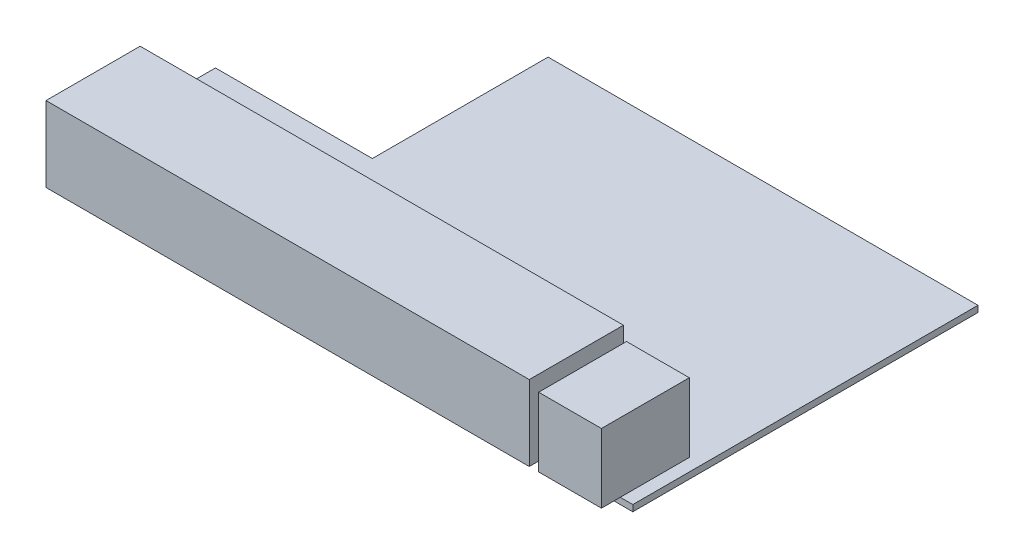
ISO-10303-21;
HEADER;
FILE_DESCRIPTION(('STEP AP214'),'2;1');
FILE_NAME('part.step','',(''),(''),'','','');
FILE_SCHEMA(('AUTOMOTIVE_DESIGN { 1 0 10303 214 1 1 1 1 }'));
ENDSEC;
DATA;
#1=APPLICATION_CONTEXT('core data for automotive mechanical design processes');
#2=APPLICATION_PROTOCOL_DEFINITION('international standard','automotive_design',2000,#1);
#3=PRODUCT_CONTEXT('',#1,'mechanical');
#4=PRODUCT('Part','Part','',(#3));
#5=PRODUCT_RELATED_PRODUCT_CATEGORY('part','',(#4));
#6=PRODUCT_DEFINITION_FORMATION('','',#4);
#7=PRODUCT_DEFINITION_CONTEXT('part definition',#1,'design');
#8=PRODUCT_DEFINITION('design','',#6,#7);
#9=PRODUCT_DEFINITION_SHAPE('','',#8);
#10=(LENGTH_UNIT() NAMED_UNIT(*) SI_UNIT(.MILLI.,.METRE.));
#11=(NAMED_UNIT(*) PLANE_ANGLE_UNIT() SI_UNIT($,.RADIAN.));
#12=(NAMED_UNIT(*) SI_UNIT($,.STERADIAN.) SOLID_ANGLE_UNIT());
#13=UNCERTAINTY_MEASURE_WITH_UNIT(LENGTH_MEASURE(1.E-05),#10,'distance_accuracy_value','');
#14=(GEOMETRIC_REPRESENTATION_CONTEXT(3) GLOBAL_UNCERTAINTY_ASSIGNED_CONTEXT((#13)) GLOBAL_UNIT_ASSIGNED_CONTEXT((#10,
#11,#12)) REPRESENTATION_CONTEXT('',''));
#15=CARTESIAN_POINT('',(0.,0.,0.));
#16=DIRECTION('',(0.,0.,1.));
#17=DIRECTION('',(1.,0.,0.));
#18=AXIS2_PLACEMENT_3D('',#15,#16,#17);
#19=CARTESIAN_POINT('',(0.,1.,0.));
#20=DIRECTION('',(0.,-1.,0.));
#21=DIRECTION('',(0.,0.,-1.));
#22=AXIS2_PLACEMENT_3D('',#19,#20,#21);
#23=PLANE('',#22);
#24=DIRECTION('',(0.,0.,1.));
#25=VECTOR('',#24,1.);
#26=CARTESIAN_POINT('',(34.5329737002502,1.,16.6276625292646));
#27=LINE('',#26,#25);
#28=CARTESIAN_POINT('',(34.5329737002502,1.,16.6276625292646));
#29=VERTEX_POINT('',#28);
#30=CARTESIAN_POINT('',(34.5329737002502,1.,27.6276625292646));
#31=VERTEX_POINT('',#30);
#32=EDGE_CURVE('E64',#29,#31,#27,.T.);
#33=ORIENTED_EDGE('',*,*,#32,.F.);
#34=DIRECTION('',(-1.,0.,0.));
#35=VECTOR('',#34,1.);
#36=CARTESIAN_POINT('',(34.5329737002502,1.,16.6276625292646));
#37=LINE('',#36,#35);
#38=CARTESIAN_POINT('',(44.5329737002502,1.,16.6276625292646));
#39=VERTEX_POINT('',#38);
#40=EDGE_CURVE('E68',#39,#29,#37,.T.);
#41=ORIENTED_EDGE('',*,*,#40,.F.);
#42=DIRECTION('',(0.,0.,-1.));
#43=VECTOR('',#42,1.);
#44=CARTESIAN_POINT('',(44.5329737002502,1.,16.6276625292646));
#45=LINE('',#44,#43);
#46=CARTESIAN_POINT('',(44.5329737002502,1.,27.6276625292646));
#47=VERTEX_POINT('',#46);
#48=EDGE_CURVE('E497',#47,#39,#45,.T.);
#49=ORIENTED_EDGE('',*,*,#48,.F.);
#50=DIRECTION('',(1.,0.,0.));
#51=VECTOR('',#50,1.);
#52=CARTESIAN_POINT('',(-46.9670262997498,1.,27.6276625292646));
#53=LINE('',#52,#51);
#54=CARTESIAN_POINT('',(46.5329737002502,1.,27.6276625292646));
#55=VERTEX_POINT('',#54);
#56=EDGE_CURVE('E253',#47,#55,#53,.T.);
#57=ORIENTED_EDGE('',*,*,#56,.T.);
#58=DIRECTION('',(0.,0.,1.));
#59=VECTOR('',#58,1.);
#60=CARTESIAN_POINT('',(46.5329737002502,1.,-27.3723374707354));
#61=LINE('',#60,#59);
#62=CARTESIAN_POINT('',(46.5329737002502,1.,-27.3723374707354));
#63=VERTEX_POINT('',#62);
#64=EDGE_CURVE('E249',#63,#55,#61,.T.);
#65=ORIENTED_EDGE('',*,*,#64,.F.);
#66=DIRECTION('',(1.,0.,0.));
#67=VECTOR('',#66,1.);
#68=CARTESIAN_POINT('',(-21.9670262997498,1.,-27.3723374707354));
#69=LINE('',#68,#67);
#70=CARTESIAN_POINT('',(-21.9670262997498,1.,-27.3723374707354));
#71=VERTEX_POINT('',#70);
#72=EDGE_CURVE('E244',#71,#63,#69,.T.);
#73=ORIENTED_EDGE('',*,*,#72,.F.);
#74=DIRECTION('',(0.,0.,-1.));
#75=VECTOR('',#74,1.);
#76=CARTESIAN_POINT('',(-21.9670262997498,1.,0.627662529264608));
#77=LINE('',#76,#75);
#78=CARTESIAN_POINT('',(-21.9670262997498,1.,0.627662529264608));
#79=VERTEX_POINT('',#78);
#80=EDGE_CURVE('E240',#79,#71,#77,.T.);
#81=ORIENTED_EDGE('',*,*,#80,.F.);
#82=DIRECTION('',(1.,0.,0.));
#83=VECTOR('',#82,1.);
#84=CARTESIAN_POINT('',(-46.9670262997498,1.,0.627662529264608));
#85=LINE('',#84,#83);
#86=CARTESIAN_POINT('',(-46.9670262997498,1.,0.627662529264608));
#87=VERTEX_POINT('',#86);
#88=EDGE_CURVE('E262',#87,#79,#85,.T.);
#89=ORIENTED_EDGE('',*,*,#88,.F.);
#90=DIRECTION('',(0.,0.,1.));
#91=VECTOR('',#90,1.);
#92=CARTESIAN_POINT('',(-46.9670262997498,1.,0.627662529264608));
#93=LINE('',#92,#91);
#94=CARTESIAN_POINT('',(-46.9670262997498,1.,27.6276625292646));
#95=VERTEX_POINT('',#94);
#96=EDGE_CURVE('E258',#87,#95,#93,.T.);
#97=ORIENTED_EDGE('',*,*,#96,.T.);
#98=CARTESIAN_POINT('',(-43.9670262997498,1.,27.6276625292646));
#99=VERTEX_POINT('',#98);
#100=EDGE_CURVE('E254',#95,#99,#53,.T.);
#101=ORIENTED_EDGE('',*,*,#100,.T.);
#102=DIRECTION('',(0.,0.,1.));
#103=VECTOR('',#102,1.);
#104=CARTESIAN_POINT('',(-43.9670262997498,1.,15.6276625292646));
#105=LINE('',#104,#103);
#106=CARTESIAN_POINT('',(-43.9670262997498,1.,15.6276625292646));
#107=VERTEX_POINT('',#106);
#108=EDGE_CURVE('E193',#107,#99,#105,.T.);
#109=ORIENTED_EDGE('',*,*,#108,.F.);
#110=DIRECTION('',(-1.,0.,0.));
#111=VECTOR('',#110,1.);
#112=CARTESIAN_POINT('',(-43.9670262997498,1.,15.6276625292646));
#113=LINE('',#112,#111);
#114=CARTESIAN_POINT('',(33.0329737002502,1.,15.6276625292646));
#115=VERTEX_POINT('',#114);
#116=EDGE_CURVE('E204',#115,#107,#113,.T.);
#117=ORIENTED_EDGE('',*,*,#116,.F.);
#118=DIRECTION('',(0.,0.,-1.));
#119=VECTOR('',#118,1.);
#120=CARTESIAN_POINT('',(33.0329737002502,1.,15.6276625292646));
#121=LINE('',#120,#119);
#122=CARTESIAN_POINT('',(33.0329737002502,1.,27.6276625292646));
#123=VERTEX_POINT('',#122);
#124=EDGE_CURVE('E11',#123,#115,#121,.T.);
#125=ORIENTED_EDGE('',*,*,#124,.F.);
#126=EDGE_CURVE('E510',#123,#31,#53,.T.);
#127=ORIENTED_EDGE('',*,*,#126,.T.);
#128=EDGE_LOOP('',(#33,#41,#49,#57,#65,#73,#81,#89,#97,#101,#109,#117,#125,#127));
#129=FACE_BOUND('',#128,.T.);
#130=ADVANCED_FACE('F45',(#129),#23,.F.);
#131=CARTESIAN_POINT('',(-21.9670262997498,1.,0.627662529264608));
#132=DIRECTION('',(-1.,0.,0.));
#133=DIRECTION('',(0.,0.,1.));
#134=AXIS2_PLACEMENT_3D('',#131,#132,#133);
#135=PLANE('',#134);
#136=DIRECTION('',(0.,0.,-1.));
#137=VECTOR('',#136,1.);
#138=CARTESIAN_POINT('',(-21.9670262997498,0.,0.627662529264608));
#139=LINE('',#138,#137);
#140=CARTESIAN_POINT('',(-21.9670262997498,0.,0.627662529264608));
#141=VERTEX_POINT('',#140);
#142=CARTESIAN_POINT('',(-21.9670262997498,0.,-27.3723374707354));
#143=VERTEX_POINT('',#142);
#144=EDGE_CURVE('E239',#141,#143,#139,.T.);
#145=ORIENTED_EDGE('',*,*,#144,.F.);
#146=DIRECTION('',(0.,-1.,0.));
#147=VECTOR('',#146,1.);
#148=CARTESIAN_POINT('',(-21.9670262997498,1.,0.627662529264608));
#149=LINE('',#148,#147);
#150=EDGE_CURVE('E55',#79,#141,#149,.T.);
#151=ORIENTED_EDGE('',*,*,#150,.F.);
#152=ORIENTED_EDGE('',*,*,#80,.T.);
#153=DIRECTION('',(0.,-1.,0.));
#154=VECTOR('',#153,1.);
#155=CARTESIAN_POINT('',(-21.9670262997498,1.,-27.3723374707354));
#156=LINE('',#155,#154);
#157=EDGE_CURVE('E49',#71,#143,#156,.T.);
#158=ORIENTED_EDGE('',*,*,#157,.T.);
#159=EDGE_LOOP('',(#145,#151,#152,#158));
#160=FACE_BOUND('',#159,.T.);
#161=ADVANCED_FACE('F47',(#160),#135,.T.);
#162=CARTESIAN_POINT('',(-46.9670262997498,1.,0.627662529264608));
#163=DIRECTION('',(0.,0.,-1.));
#164=DIRECTION('',(-1.,0.,0.));
#165=AXIS2_PLACEMENT_3D('',#162,#163,#164);
#166=PLANE('',#165);
#167=DIRECTION('',(1.,0.,0.));
#168=VECTOR('',#167,1.);
#169=CARTESIAN_POINT('',(-46.9670262997498,0.,0.627662529264608));
#170=LINE('',#169,#168);
#171=CARTESIAN_POINT('',(-46.9670262997498,0.,0.627662529264608));
#172=VERTEX_POINT('',#171);
#173=EDGE_CURVE('E245',#172,#141,#170,.T.);
#174=ORIENTED_EDGE('',*,*,#173,.F.);
#175=DIRECTION('',(0.,-1.,0.));
#176=VECTOR('',#175,1.);
#177=CARTESIAN_POINT('',(-46.9670262997498,1.,0.627662529264608));
#178=LINE('',#177,#176);
#179=EDGE_CURVE('E289',#87,#172,#178,.T.);
#180=ORIENTED_EDGE('',*,*,#179,.F.);
#181=ORIENTED_EDGE('',*,*,#88,.T.);
#182=ORIENTED_EDGE('',*,*,#150,.T.);
#183=EDGE_LOOP('',(#174,#180,#181,#182));
#184=FACE_BOUND('',#183,.T.);
#185=ADVANCED_FACE('F315',(#184),#166,.T.);
#186=CARTESIAN_POINT('',(-46.9670262997498,1.,0.627662529264608));
#187=DIRECTION('',(1.,0.,0.));
#188=DIRECTION('',(0.,0.,-1.));
#189=AXIS2_PLACEMENT_3D('',#186,#187,#188);
#190=PLANE('',#189);
#191=DIRECTION('',(0.,0.,1.));
#192=VECTOR('',#191,1.);
#193=CARTESIAN_POINT('',(-46.9670262997498,0.,0.627662529264608));
#194=LINE('',#193,#192);
#195=CARTESIAN_POINT('',(-46.9670262997498,0.,27.6276625292646));
#196=VERTEX_POINT('',#195);
#197=EDGE_CURVE('E281',#172,#196,#194,.T.);
#198=ORIENTED_EDGE('',*,*,#197,.T.);
#199=DIRECTION('',(0.,-1.,0.));
#200=VECTOR('',#199,1.);
#201=CARTESIAN_POINT('',(-46.9670262997498,1.,27.6276625292646));
#202=LINE('',#201,#200);
#203=EDGE_CURVE('E292',#95,#196,#202,.T.);
#204=ORIENTED_EDGE('',*,*,#203,.F.);
#205=ORIENTED_EDGE('',*,*,#96,.F.);
#206=ORIENTED_EDGE('',*,*,#179,.T.);
#207=EDGE_LOOP('',(#198,#204,#205,#206));
#208=FACE_BOUND('',#207,.T.);
#209=ADVANCED_FACE('F327',(#208),#190,.F.);
#210=CARTESIAN_POINT('',(-46.9670262997498,1.,27.6276625292646));
#211=DIRECTION('',(0.,0.,-1.));
#212=DIRECTION('',(-1.,0.,0.));
#213=AXIS2_PLACEMENT_3D('',#210,#211,#212);
#214=PLANE('',#213);
#215=DIRECTION('',(1.,0.,0.));
#216=VECTOR('',#215,1.);
#217=CARTESIAN_POINT('',(-46.9670262997498,0.,27.6276625292646));
#218=LINE('',#217,#216);
#219=CARTESIAN_POINT('',(46.5329737002502,0.,27.6276625292646));
#220=VERTEX_POINT('',#219);
#221=EDGE_CURVE('E277',#196,#220,#218,.T.);
#222=ORIENTED_EDGE('',*,*,#221,.T.);
#223=DIRECTION('',(0.,-1.,0.));
#224=VECTOR('',#223,1.);
#225=CARTESIAN_POINT('',(46.5329737002502,1.,27.6276625292646));
#226=LINE('',#225,#224);
#227=EDGE_CURVE('E296',#55,#220,#226,.T.);
#228=ORIENTED_EDGE('',*,*,#227,.F.);
#229=ORIENTED_EDGE('',*,*,#56,.F.);
#230=EDGE_CURVE('E508',#31,#47,#53,.T.);
#231=ORIENTED_EDGE('',*,*,#230,.F.);
#232=ORIENTED_EDGE('',*,*,#126,.F.);
#233=EDGE_CURVE('E259',#99,#123,#53,.T.);
#234=ORIENTED_EDGE('',*,*,#233,.F.);
#235=ORIENTED_EDGE('',*,*,#100,.F.);
#236=ORIENTED_EDGE('',*,*,#203,.T.);
#237=EDGE_LOOP('',(#222,#228,#229,#231,#232,#234,#235,#236));
#238=FACE_BOUND('',#237,.T.);
#239=ADVANCED_FACE('F323',(#238),#214,.F.);
#240=CARTESIAN_POINT('',(46.5329737002502,1.,-27.3723374707354));
#241=DIRECTION('',(1.,0.,0.));
#242=DIRECTION('',(0.,0.,-1.));
#243=AXIS2_PLACEMENT_3D('',#240,#241,#242);
#244=PLANE('',#243);
#245=DIRECTION('',(0.,0.,1.));
#246=VECTOR('',#245,1.);
#247=CARTESIAN_POINT('',(46.5329737002502,0.,-27.3723374707354));
#248=LINE('',#247,#246);
#249=CARTESIAN_POINT('',(46.5329737002502,0.,-27.3723374707354));
#250=VERTEX_POINT('',#249);
#251=EDGE_CURVE('E273',#250,#220,#248,.T.);
#252=ORIENTED_EDGE('',*,*,#251,.F.);
#253=DIRECTION('',(0.,-1.,0.));
#254=VECTOR('',#253,1.);
#255=CARTESIAN_POINT('',(46.5329737002502,1.,-27.3723374707354));
#256=LINE('',#255,#254);
#257=EDGE_CURVE('E298',#63,#250,#256,.T.);
#258=ORIENTED_EDGE('',*,*,#257,.F.);
#259=ORIENTED_EDGE('',*,*,#64,.T.);
#260=ORIENTED_EDGE('',*,*,#227,.T.);
#261=EDGE_LOOP('',(#252,#258,#259,#260));
#262=FACE_BOUND('',#261,.T.);
#263=ADVANCED_FACE('F321',(#262),#244,.T.);
#264=CARTESIAN_POINT('',(-21.9670262997498,1.,-27.3723374707354));
#265=DIRECTION('',(0.,0.,-1.));
#266=DIRECTION('',(-1.,0.,0.));
#267=AXIS2_PLACEMENT_3D('',#264,#265,#266);
#268=PLANE('',#267);
#269=DIRECTION('',(1.,0.,0.));
#270=VECTOR('',#269,1.);
#271=CARTESIAN_POINT('',(-21.9670262997498,0.,-27.3723374707354));
#272=LINE('',#271,#270);
#273=EDGE_CURVE('E269',#143,#250,#272,.T.);
#274=ORIENTED_EDGE('',*,*,#273,.F.);
#275=ORIENTED_EDGE('',*,*,#157,.F.);
#276=ORIENTED_EDGE('',*,*,#72,.T.);
#277=ORIENTED_EDGE('',*,*,#257,.T.);
#278=EDGE_LOOP('',(#274,#275,#276,#277));
#279=FACE_BOUND('',#278,.T.);
#280=ADVANCED_FACE('F308',(#279),#268,.T.);
#281=CARTESIAN_POINT('',(0.,0.,0.));
#282=DIRECTION('',(0.,-1.,0.));
#283=DIRECTION('',(0.,0.,-1.));
#284=AXIS2_PLACEMENT_3D('',#281,#282,#283);
#285=PLANE('',#284);
#286=ORIENTED_EDGE('',*,*,#144,.T.);
#287=ORIENTED_EDGE('',*,*,#273,.T.);
#288=ORIENTED_EDGE('',*,*,#251,.T.);
#289=ORIENTED_EDGE('',*,*,#221,.F.);
#290=ORIENTED_EDGE('',*,*,#197,.F.);
#291=ORIENTED_EDGE('',*,*,#173,.T.);
#292=EDGE_LOOP('',(#286,#287,#288,#289,#290,#291));
#293=FACE_BOUND('',#292,.T.);
#294=ADVANCED_FACE('F310',(#293),#285,.T.);
#295=CARTESIAN_POINT('',(0.,1.,0.));
#296=DIRECTION('',(0.,1.,0.));
#297=DIRECTION('',(0.,0.,1.));
#298=AXIS2_PLACEMENT_3D('',#295,#296,#297);
#299=PLANE('',#298);
#300=CARTESIAN_POINT('',(-43.9670262997498,1.,30.6276625292646));
#301=VERTEX_POINT('',#300);
#302=EDGE_CURVE('E189',#99,#301,#105,.T.);
#303=ORIENTED_EDGE('',*,*,#302,.F.);
#304=ORIENTED_EDGE('',*,*,#233,.T.);
#305=CARTESIAN_POINT('',(33.0329737002502,1.,30.6276625292646));
#306=VERTEX_POINT('',#305);
#307=EDGE_CURVE('E57',#306,#123,#121,.T.);
#308=ORIENTED_EDGE('',*,*,#307,.F.);
#309=DIRECTION('',(1.,0.,0.));
#310=VECTOR('',#309,1.);
#311=CARTESIAN_POINT('',(-43.9670262997498,1.,30.6276625292646));
#312=LINE('',#311,#310);
#313=EDGE_CURVE('E216',#301,#306,#312,.T.);
#314=ORIENTED_EDGE('',*,*,#313,.F.);
#315=EDGE_LOOP('',(#303,#304,#308,#314));
#316=FACE_BOUND('',#315,.T.);
#317=ADVANCED_FACE('F332',(#316),#299,.F.);
#318=CARTESIAN_POINT('',(-43.9670262997498,13.,15.6276625292646));
#319=DIRECTION('',(1.,0.,0.));
#320=DIRECTION('',(0.,0.,-1.));
#321=AXIS2_PLACEMENT_3D('',#318,#319,#320);
#322=PLANE('',#321);
#323=ORIENTED_EDGE('',*,*,#108,.T.);
#324=ORIENTED_EDGE('',*,*,#302,.T.);
#325=DIRECTION('',(0.,-1.,0.));
#326=VECTOR('',#325,1.);
#327=CARTESIAN_POINT('',(-43.9670262997498,13.,30.6276625292646));
#328=LINE('',#327,#326);
#329=CARTESIAN_POINT('',(-43.9670262997498,13.,30.6276625292646));
#330=VERTEX_POINT('',#329);
#331=EDGE_CURVE('E235',#330,#301,#328,.T.);
#332=ORIENTED_EDGE('',*,*,#331,.F.);
#333=DIRECTION('',(0.,0.,1.));
#334=VECTOR('',#333,1.);
#335=CARTESIAN_POINT('',(-43.9670262997498,13.,15.6276625292646));
#336=LINE('',#335,#334);
#337=CARTESIAN_POINT('',(-43.9670262997498,13.,15.6276625292646));
#338=VERTEX_POINT('',#337);
#339=EDGE_CURVE('E199',#338,#330,#336,.T.);
#340=ORIENTED_EDGE('',*,*,#339,.F.);
#341=DIRECTION('',(0.,-1.,0.));
#342=VECTOR('',#341,1.);
#343=CARTESIAN_POINT('',(-43.9670262997498,13.,15.6276625292646));
#344=LINE('',#343,#342);
#345=EDGE_CURVE('E212',#338,#107,#344,.T.);
#346=ORIENTED_EDGE('',*,*,#345,.T.);
#347=EDGE_LOOP('',(#323,#324,#332,#340,#346));
#348=FACE_BOUND('',#347,.T.);
#349=ADVANCED_FACE('F336',(#348),#322,.F.);
#350=CARTESIAN_POINT('',(-43.9670262997498,13.,30.6276625292646));
#351=DIRECTION('',(0.,0.,-1.));
#352=DIRECTION('',(-1.,0.,0.));
#353=AXIS2_PLACEMENT_3D('',#350,#351,#352);
#354=PLANE('',#353);
#355=ORIENTED_EDGE('',*,*,#313,.T.);
#356=DIRECTION('',(0.,-1.,0.));
#357=VECTOR('',#356,1.);
#358=CARTESIAN_POINT('',(33.0329737002502,13.,30.6276625292646));
#359=LINE('',#358,#357);
#360=CARTESIAN_POINT('',(33.0329737002502,13.,30.6276625292646));
#361=VERTEX_POINT('',#360);
#362=EDGE_CURVE('E231',#361,#306,#359,.T.);
#363=ORIENTED_EDGE('',*,*,#362,.F.);
#364=DIRECTION('',(1.,0.,0.));
#365=VECTOR('',#364,1.);
#366=CARTESIAN_POINT('',(-43.9670262997498,13.,30.6276625292646));
#367=LINE('',#366,#365);
#368=EDGE_CURVE('E203',#330,#361,#367,.T.);
#369=ORIENTED_EDGE('',*,*,#368,.F.);
#370=ORIENTED_EDGE('',*,*,#331,.T.);
#371=EDGE_LOOP('',(#355,#363,#369,#370));
#372=FACE_BOUND('',#371,.T.);
#373=ADVANCED_FACE('F349',(#372),#354,.F.);
#374=CARTESIAN_POINT('',(33.0329737002502,13.,15.6276625292646));
#375=DIRECTION('',(-1.,0.,0.));
#376=DIRECTION('',(0.,0.,1.));
#377=AXIS2_PLACEMENT_3D('',#374,#375,#376);
#378=PLANE('',#377);
#379=ORIENTED_EDGE('',*,*,#307,.T.);
#380=ORIENTED_EDGE('',*,*,#124,.T.);
#381=DIRECTION('',(0.,-1.,0.));
#382=VECTOR('',#381,1.);
#383=CARTESIAN_POINT('',(33.0329737002502,13.,15.6276625292646));
#384=LINE('',#383,#382);
#385=CARTESIAN_POINT('',(33.0329737002502,13.,15.6276625292646));
#386=VERTEX_POINT('',#385);
#387=EDGE_CURVE('E227',#386,#115,#384,.T.);
#388=ORIENTED_EDGE('',*,*,#387,.F.);
#389=DIRECTION('',(0.,0.,-1.));
#390=VECTOR('',#389,1.);
#391=CARTESIAN_POINT('',(33.0329737002502,13.,15.6276625292646));
#392=LINE('',#391,#390);
#393=EDGE_CURVE('E207',#361,#386,#392,.T.);
#394=ORIENTED_EDGE('',*,*,#393,.F.);
#395=ORIENTED_EDGE('',*,*,#362,.T.);
#396=EDGE_LOOP('',(#379,#380,#388,#394,#395));
#397=FACE_BOUND('',#396,.T.);
#398=ADVANCED_FACE('F345',(#397),#378,.F.);
#399=CARTESIAN_POINT('',(-43.9670262997498,13.,15.6276625292646));
#400=DIRECTION('',(0.,0.,1.));
#401=DIRECTION('',(1.,0.,0.));
#402=AXIS2_PLACEMENT_3D('',#399,#400,#401);
#403=PLANE('',#402);
#404=ORIENTED_EDGE('',*,*,#116,.T.);
#405=ORIENTED_EDGE('',*,*,#345,.F.);
#406=DIRECTION('',(-1.,0.,0.));
#407=VECTOR('',#406,1.);
#408=CARTESIAN_POINT('',(-43.9670262997498,13.,15.6276625292646));
#409=LINE('',#408,#407);
#410=EDGE_CURVE('E210',#386,#338,#409,.T.);
#411=ORIENTED_EDGE('',*,*,#410,.F.);
#412=ORIENTED_EDGE('',*,*,#387,.T.);
#413=EDGE_LOOP('',(#404,#405,#411,#412));
#414=FACE_BOUND('',#413,.T.);
#415=ADVANCED_FACE('F341',(#414),#403,.F.);
#416=CARTESIAN_POINT('',(0.,13.,0.));
#417=DIRECTION('',(0.,1.,0.));
#418=DIRECTION('',(0.,0.,1.));
#419=AXIS2_PLACEMENT_3D('',#416,#417,#418);
#420=PLANE('',#419);
#421=ORIENTED_EDGE('',*,*,#339,.T.);
#422=ORIENTED_EDGE('',*,*,#368,.T.);
#423=ORIENTED_EDGE('',*,*,#393,.T.);
#424=ORIENTED_EDGE('',*,*,#410,.T.);
#425=EDGE_LOOP('',(#421,#422,#423,#424));
#426=FACE_BOUND('',#425,.T.);
#427=ADVANCED_FACE('F351',(#426),#420,.T.);
#428=CARTESIAN_POINT('',(0.,1.,0.));
#429=DIRECTION('',(0.,1.,0.));
#430=DIRECTION('',(0.,0.,1.));
#431=AXIS2_PLACEMENT_3D('',#428,#429,#430);
#432=PLANE('',#431);
#433=CARTESIAN_POINT('',(34.5329737002502,1.,30.6276625292646));
#434=VERTEX_POINT('',#433);
#435=EDGE_CURVE('E186',#31,#434,#27,.T.);
#436=ORIENTED_EDGE('',*,*,#435,.F.);
#437=ORIENTED_EDGE('',*,*,#230,.T.);
#438=CARTESIAN_POINT('',(44.5329737002502,1.,30.6276625292646));
#439=VERTEX_POINT('',#438);
#440=EDGE_CURVE('E486',#439,#47,#45,.T.);
#441=ORIENTED_EDGE('',*,*,#440,.F.);
#442=DIRECTION('',(1.,0.,0.));
#443=VECTOR('',#442,1.);
#444=CARTESIAN_POINT('',(34.5329737002502,1.,30.6276625292646));
#445=LINE('',#444,#443);
#446=EDGE_CURVE('E498',#434,#439,#445,.T.);
#447=ORIENTED_EDGE('',*,*,#446,.F.);
#448=EDGE_LOOP('',(#436,#437,#441,#447));
#449=FACE_BOUND('',#448,.T.);
#450=ADVANCED_FACE('F353',(#449),#432,.F.);
#451=CARTESIAN_POINT('',(34.5329737002502,12.,16.6276625292646));
#452=DIRECTION('',(1.,0.,0.));
#453=DIRECTION('',(0.,0.,-1.));
#454=AXIS2_PLACEMENT_3D('',#451,#452,#453);
#455=PLANE('',#454);
#456=ORIENTED_EDGE('',*,*,#32,.T.);
#457=ORIENTED_EDGE('',*,*,#435,.T.);
#458=DIRECTION('',(0.,-1.,0.));
#459=VECTOR('',#458,1.);
#460=CARTESIAN_POINT('',(34.5329737002502,12.,30.6276625292646));
#461=LINE('',#460,#459);
#462=CARTESIAN_POINT('',(34.5329737002502,12.,30.6276625292646));
#463=VERTEX_POINT('',#462);
#464=EDGE_CURVE('E166',#463,#434,#461,.T.);
#465=ORIENTED_EDGE('',*,*,#464,.F.);
#466=DIRECTION('',(0.,0.,1.));
#467=VECTOR('',#466,1.);
#468=CARTESIAN_POINT('',(34.5329737002502,12.,16.6276625292646));
#469=LINE('',#468,#467);
#470=CARTESIAN_POINT('',(34.5329737002502,12.,16.6276625292646));
#471=VERTEX_POINT('',#470);
#472=EDGE_CURVE('E173',#471,#463,#469,.T.);
#473=ORIENTED_EDGE('',*,*,#472,.F.);
#474=DIRECTION('',(0.,-1.,0.));
#475=VECTOR('',#474,1.);
#476=CARTESIAN_POINT('',(34.5329737002502,12.,16.6276625292646));
#477=LINE('',#476,#475);
#478=EDGE_CURVE('E483',#471,#29,#477,.T.);
#479=ORIENTED_EDGE('',*,*,#478,.T.);
#480=EDGE_LOOP('',(#456,#457,#465,#473,#479));
#481=FACE_BOUND('',#480,.T.);
#482=ADVANCED_FACE('F184',(#481),#455,.F.);
#483=CARTESIAN_POINT('',(34.5329737002502,12.,30.6276625292646));
#484=DIRECTION('',(0.,0.,-1.));
#485=DIRECTION('',(-1.,0.,0.));
#486=AXIS2_PLACEMENT_3D('',#483,#484,#485);
#487=PLANE('',#486);
#488=ORIENTED_EDGE('',*,*,#446,.T.);
#489=DIRECTION('',(0.,-1.,0.));
#490=VECTOR('',#489,1.);
#491=CARTESIAN_POINT('',(44.5329737002502,12.,30.6276625292646));
#492=LINE('',#491,#490);
#493=CARTESIAN_POINT('',(44.5329737002502,12.,30.6276625292646));
#494=VERTEX_POINT('',#493);
#495=EDGE_CURVE('E168',#494,#439,#492,.T.);
#496=ORIENTED_EDGE('',*,*,#495,.F.);
#497=DIRECTION('',(1.,0.,0.));
#498=VECTOR('',#497,1.);
#499=CARTESIAN_POINT('',(34.5329737002502,12.,30.6276625292646));
#500=LINE('',#499,#498);
#501=EDGE_CURVE('E162',#463,#494,#500,.T.);
#502=ORIENTED_EDGE('',*,*,#501,.F.);
#503=ORIENTED_EDGE('',*,*,#464,.T.);
#504=EDGE_LOOP('',(#488,#496,#502,#503));
#505=FACE_BOUND('',#504,.T.);
#506=ADVANCED_FACE('F164',(#505),#487,.F.);
#507=CARTESIAN_POINT('',(44.5329737002502,12.,16.6276625292646));
#508=DIRECTION('',(-1.,0.,0.));
#509=DIRECTION('',(0.,0.,1.));
#510=AXIS2_PLACEMENT_3D('',#507,#508,#509);
#511=PLANE('',#510);
#512=ORIENTED_EDGE('',*,*,#440,.T.);
#513=ORIENTED_EDGE('',*,*,#48,.T.);
#514=DIRECTION('',(0.,-1.,0.));
#515=VECTOR('',#514,1.);
#516=CARTESIAN_POINT('',(44.5329737002502,12.,16.6276625292646));
#517=LINE('',#516,#515);
#518=CARTESIAN_POINT('',(44.5329737002502,12.,16.6276625292646));
#519=VERTEX_POINT('',#518);
#520=EDGE_CURVE('E195',#519,#39,#517,.T.);
#521=ORIENTED_EDGE('',*,*,#520,.F.);
#522=DIRECTION('',(0.,0.,-1.));
#523=VECTOR('',#522,1.);
#524=CARTESIAN_POINT('',(44.5329737002502,12.,16.6276625292646));
#525=LINE('',#524,#523);
#526=EDGE_CURVE('E172',#494,#519,#525,.T.);
#527=ORIENTED_EDGE('',*,*,#526,.F.);
#528=ORIENTED_EDGE('',*,*,#495,.T.);
#529=EDGE_LOOP('',(#512,#513,#521,#527,#528));
#530=FACE_BOUND('',#529,.T.);
#531=ADVANCED_FACE('F452',(#530),#511,.F.);
#532=CARTESIAN_POINT('',(34.5329737002502,12.,16.6276625292646));
#533=DIRECTION('',(0.,0.,1.));
#534=DIRECTION('',(1.,0.,0.));
#535=AXIS2_PLACEMENT_3D('',#532,#533,#534);
#536=PLANE('',#535);
#537=ORIENTED_EDGE('',*,*,#40,.T.);
#538=ORIENTED_EDGE('',*,*,#478,.F.);
#539=DIRECTION('',(-1.,0.,0.));
#540=VECTOR('',#539,1.);
#541=CARTESIAN_POINT('',(34.5329737002502,12.,16.6276625292646));
#542=LINE('',#541,#540);
#543=EDGE_CURVE('E178',#519,#471,#542,.T.);
#544=ORIENTED_EDGE('',*,*,#543,.F.);
#545=ORIENTED_EDGE('',*,*,#520,.T.);
#546=EDGE_LOOP('',(#537,#538,#544,#545));
#547=FACE_BOUND('',#546,.T.);
#548=ADVANCED_FACE('F461',(#547),#536,.F.);
#549=CARTESIAN_POINT('',(0.,12.,0.));
#550=DIRECTION('',(0.,1.,0.));
#551=DIRECTION('',(0.,0.,1.));
#552=AXIS2_PLACEMENT_3D('',#549,#550,#551);
#553=PLANE('',#552);
#554=ORIENTED_EDGE('',*,*,#472,.T.);
#555=ORIENTED_EDGE('',*,*,#501,.T.);
#556=ORIENTED_EDGE('',*,*,#526,.T.);
#557=ORIENTED_EDGE('',*,*,#543,.T.);
#558=EDGE_LOOP('',(#554,#555,#556,#557));
#559=FACE_BOUND('',#558,.T.);
#560=ADVANCED_FACE('F176',(#559),#553,.T.);
#561=CLOSED_SHELL('',(#130,#161,#185,#209,#239,#263,#280,#294,#317,#349,#373,#398,#415,#427,
#450,#482,#506,#531,#548,#560));
#562=MANIFOLD_SOLID_BREP('B2',#561);
#563=ADVANCED_BREP_SHAPE_REPRESENTATION('',(#18,#562),#14);
#564=SHAPE_DEFINITION_REPRESENTATION(#9,#563);
ENDSEC;
END-ISO-10303-21;
